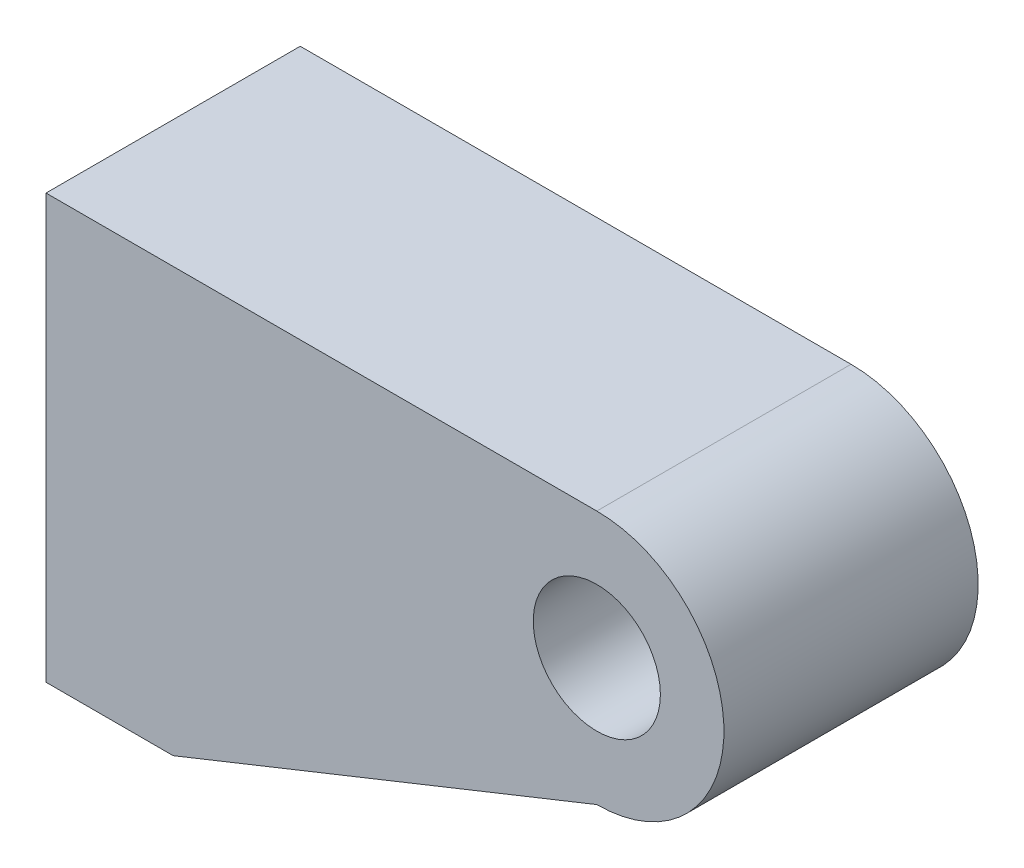
ISO-10303-21;
HEADER;
FILE_DESCRIPTION(('STEP AP214'),'2;1');
FILE_NAME('part.step','',(''),(''),'','','');
FILE_SCHEMA(('AUTOMOTIVE_DESIGN { 1 0 10303 214 1 1 1 1 }'));
ENDSEC;
DATA;
#1=APPLICATION_CONTEXT('core data for automotive mechanical design processes');
#2=APPLICATION_PROTOCOL_DEFINITION('international standard','automotive_design',2000,#1);
#3=PRODUCT_CONTEXT('',#1,'mechanical');
#4=PRODUCT('Part','Part','',(#3));
#5=PRODUCT_RELATED_PRODUCT_CATEGORY('part','',(#4));
#6=PRODUCT_DEFINITION_FORMATION('','',#4);
#7=PRODUCT_DEFINITION_CONTEXT('part definition',#1,'design');
#8=PRODUCT_DEFINITION('design','',#6,#7);
#9=PRODUCT_DEFINITION_SHAPE('','',#8);
#10=(LENGTH_UNIT() NAMED_UNIT(*) SI_UNIT(.MILLI.,.METRE.));
#11=(NAMED_UNIT(*) PLANE_ANGLE_UNIT() SI_UNIT($,.RADIAN.));
#12=(NAMED_UNIT(*) SI_UNIT($,.STERADIAN.) SOLID_ANGLE_UNIT());
#13=UNCERTAINTY_MEASURE_WITH_UNIT(LENGTH_MEASURE(1.E-05),#10,'distance_accuracy_value','');
#14=(GEOMETRIC_REPRESENTATION_CONTEXT(3) GLOBAL_UNCERTAINTY_ASSIGNED_CONTEXT((#13)) GLOBAL_UNIT_ASSIGNED_CONTEXT((#10,
#11,#12)) REPRESENTATION_CONTEXT('',''));
#15=CARTESIAN_POINT('',(0.,0.,0.));
#16=DIRECTION('',(0.,0.,1.));
#17=DIRECTION('',(1.,0.,0.));
#18=AXIS2_PLACEMENT_3D('',#15,#16,#17);
#19=CARTESIAN_POINT('',(13.,-3.,6.));
#20=DIRECTION('',(0.,0.,-1.));
#21=DIRECTION('',(-1.,0.,0.));
#22=AXIS2_PLACEMENT_3D('',#19,#20,#21);
#23=PLANE('',#22);
#24=DIRECTION('',(0.,-1.,0.));
#25=VECTOR('',#24,1.);
#26=CARTESIAN_POINT('',(0.,0.,6.));
#27=LINE('',#26,#25);
#28=CARTESIAN_POINT('',(0.,0.,6.));
#29=VERTEX_POINT('',#28);
#30=CARTESIAN_POINT('',(0.,-10.,6.));
#31=VERTEX_POINT('',#30);
#32=EDGE_CURVE('E116',#29,#31,#27,.T.);
#33=ORIENTED_EDGE('',*,*,#32,.T.);
#34=DIRECTION('',(1.,0.,0.));
#35=VECTOR('',#34,1.);
#36=CARTESIAN_POINT('',(0.,-10.,6.));
#37=LINE('',#36,#35);
#38=CARTESIAN_POINT('',(3.,-10.,6.));
#39=VERTEX_POINT('',#38);
#40=EDGE_CURVE('E83',#31,#39,#37,.T.);
#41=ORIENTED_EDGE('',*,*,#40,.T.);
#42=DIRECTION('',(0.928476690885259,0.371390676354104,0.));
#43=VECTOR('',#42,1.);
#44=CARTESIAN_POINT('',(3.,-10.,6.));
#45=LINE('',#44,#43);
#46=CARTESIAN_POINT('',(13.,-6.,6.));
#47=VERTEX_POINT('',#46);
#48=EDGE_CURVE('E87',#39,#47,#45,.T.);
#49=ORIENTED_EDGE('',*,*,#48,.T.);
#50=CARTESIAN_POINT('',(13.,-3.,6.));
#51=DIRECTION('',(0.,0.,1.));
#52=DIRECTION('',(-1.,0.,0.));
#53=AXIS2_PLACEMENT_3D('',#50,#51,#52);
#54=CIRCLE('',#53,3.);
#55=CARTESIAN_POINT('',(13.,0.,6.));
#56=VERTEX_POINT('',#55);
#57=EDGE_CURVE('E91',#47,#56,#54,.T.);
#58=ORIENTED_EDGE('',*,*,#57,.T.);
#59=DIRECTION('',(-1.,0.,0.));
#60=VECTOR('',#59,1.);
#61=CARTESIAN_POINT('',(0.,0.,6.));
#62=LINE('',#61,#60);
#63=EDGE_CURVE('E49',#56,#29,#62,.T.);
#64=ORIENTED_EDGE('',*,*,#63,.T.);
#65=EDGE_LOOP('',(#33,#41,#49,#58,#64));
#66=FACE_BOUND('',#65,.T.);
#67=CARTESIAN_POINT('',(13.,-3.,6.));
#68=DIRECTION('',(0.,0.,1.));
#69=DIRECTION('',(1.,0.,0.));
#70=AXIS2_PLACEMENT_3D('',#67,#68,#69);
#71=CIRCLE('',#70,1.5);
#72=CARTESIAN_POINT('',(14.5,-3.,6.));
#73=VERTEX_POINT('',#72);
#74=EDGE_CURVE('E111',#73,#73,#71,.T.);
#75=ORIENTED_EDGE('',*,*,#74,.F.);
#76=EDGE_LOOP('',(#75));
#77=FACE_BOUND('',#76,.T.);
#78=ADVANCED_FACE('F32',(#66,#77),#23,.F.);
#79=CARTESIAN_POINT('',(13.,-3.,0.));
#80=DIRECTION('',(0.,0.,-1.));
#81=DIRECTION('',(-1.,0.,0.));
#82=AXIS2_PLACEMENT_3D('',#79,#80,#81);
#83=PLANE('',#82);
#84=DIRECTION('',(0.,-1.,0.));
#85=VECTOR('',#84,1.);
#86=CARTESIAN_POINT('',(0.,0.,0.));
#87=LINE('',#86,#85);
#88=CARTESIAN_POINT('',(0.,0.,0.));
#89=VERTEX_POINT('',#88);
#90=CARTESIAN_POINT('',(0.,-10.,0.));
#91=VERTEX_POINT('',#90);
#92=EDGE_CURVE('E107',#89,#91,#87,.T.);
#93=ORIENTED_EDGE('',*,*,#92,.F.);
#94=DIRECTION('',(-1.,0.,0.));
#95=VECTOR('',#94,1.);
#96=CARTESIAN_POINT('',(0.,0.,0.));
#97=LINE('',#96,#95);
#98=CARTESIAN_POINT('',(13.,0.,0.));
#99=VERTEX_POINT('',#98);
#100=EDGE_CURVE('E75',#99,#89,#97,.T.);
#101=ORIENTED_EDGE('',*,*,#100,.F.);
#102=CARTESIAN_POINT('',(13.,-3.,0.));
#103=DIRECTION('',(0.,0.,1.));
#104=DIRECTION('',(-1.,0.,0.));
#105=AXIS2_PLACEMENT_3D('',#102,#103,#104);
#106=CIRCLE('',#105,3.);
#107=CARTESIAN_POINT('',(13.,-6.,0.));
#108=VERTEX_POINT('',#107);
#109=EDGE_CURVE('E69',#108,#99,#106,.T.);
#110=ORIENTED_EDGE('',*,*,#109,.F.);
#111=DIRECTION('',(0.928476690885259,0.371390676354104,0.));
#112=VECTOR('',#111,1.);
#113=CARTESIAN_POINT('',(3.,-10.,0.));
#114=LINE('',#113,#112);
#115=CARTESIAN_POINT('',(3.,-10.,0.));
#116=VERTEX_POINT('',#115);
#117=EDGE_CURVE('E98',#116,#108,#114,.T.);
#118=ORIENTED_EDGE('',*,*,#117,.F.);
#119=DIRECTION('',(1.,0.,0.));
#120=VECTOR('',#119,1.);
#121=CARTESIAN_POINT('',(0.,-10.,0.));
#122=LINE('',#121,#120);
#123=EDGE_CURVE('E110',#91,#116,#122,.T.);
#124=ORIENTED_EDGE('',*,*,#123,.F.);
#125=EDGE_LOOP('',(#93,#101,#110,#118,#124));
#126=FACE_BOUND('',#125,.T.);
#127=CARTESIAN_POINT('',(13.,-3.,0.));
#128=DIRECTION('',(0.,0.,1.));
#129=DIRECTION('',(1.,0.,0.));
#130=AXIS2_PLACEMENT_3D('',#127,#128,#129);
#131=CIRCLE('',#130,1.5);
#132=CARTESIAN_POINT('',(14.5,-3.,0.));
#133=VERTEX_POINT('',#132);
#134=EDGE_CURVE('E196',#133,#133,#131,.T.);
#135=ORIENTED_EDGE('',*,*,#134,.T.);
#136=EDGE_LOOP('',(#135));
#137=FACE_BOUND('',#136,.T.);
#138=ADVANCED_FACE('F120',(#126,#137),#83,.T.);
#139=CARTESIAN_POINT('',(0.,0.,6.));
#140=DIRECTION('',(1.,0.,0.));
#141=DIRECTION('',(0.,1.,0.));
#142=AXIS2_PLACEMENT_3D('',#139,#140,#141);
#143=PLANE('',#142);
#144=ORIENTED_EDGE('',*,*,#92,.T.);
#145=DIRECTION('',(0.,0.,-1.));
#146=VECTOR('',#145,1.);
#147=CARTESIAN_POINT('',(0.,-10.,6.));
#148=LINE('',#147,#146);
#149=EDGE_CURVE('E11',#31,#91,#148,.T.);
#150=ORIENTED_EDGE('',*,*,#149,.F.);
#151=ORIENTED_EDGE('',*,*,#32,.F.);
#152=DIRECTION('',(0.,0.,-1.));
#153=VECTOR('',#152,1.);
#154=CARTESIAN_POINT('',(0.,0.,6.));
#155=LINE('',#154,#153);
#156=EDGE_CURVE('E103',#29,#89,#155,.T.);
#157=ORIENTED_EDGE('',*,*,#156,.T.);
#158=EDGE_LOOP('',(#144,#150,#151,#157));
#159=FACE_BOUND('',#158,.T.);
#160=ADVANCED_FACE('F34',(#159),#143,.F.);
#161=CARTESIAN_POINT('',(0.,-10.,6.));
#162=DIRECTION('',(0.,1.,0.));
#163=DIRECTION('',(0.,0.,1.));
#164=AXIS2_PLACEMENT_3D('',#161,#162,#163);
#165=PLANE('',#164);
#166=ORIENTED_EDGE('',*,*,#123,.T.);
#167=DIRECTION('',(0.,0.,-1.));
#168=VECTOR('',#167,1.);
#169=CARTESIAN_POINT('',(3.,-10.,6.));
#170=LINE('',#169,#168);
#171=EDGE_CURVE('E41',#39,#116,#170,.T.);
#172=ORIENTED_EDGE('',*,*,#171,.F.);
#173=ORIENTED_EDGE('',*,*,#40,.F.);
#174=ORIENTED_EDGE('',*,*,#149,.T.);
#175=EDGE_LOOP('',(#166,#172,#173,#174));
#176=FACE_BOUND('',#175,.T.);
#177=ADVANCED_FACE('F145',(#176),#165,.F.);
#178=CARTESIAN_POINT('',(3.,-10.,6.));
#179=DIRECTION('',(-0.371390676354104,0.928476690885259,0.));
#180=DIRECTION('',(-0.928476690885259,-0.371390676354104,0.));
#181=AXIS2_PLACEMENT_3D('',#178,#179,#180);
#182=PLANE('',#181);
#183=ORIENTED_EDGE('',*,*,#117,.T.);
#184=DIRECTION('',(0.,0.,-1.));
#185=VECTOR('',#184,1.);
#186=CARTESIAN_POINT('',(13.,-6.,6.));
#187=LINE('',#186,#185);
#188=EDGE_CURVE('E95',#47,#108,#187,.T.);
#189=ORIENTED_EDGE('',*,*,#188,.F.);
#190=ORIENTED_EDGE('',*,*,#48,.F.);
#191=ORIENTED_EDGE('',*,*,#171,.T.);
#192=EDGE_LOOP('',(#183,#189,#190,#191));
#193=FACE_BOUND('',#192,.T.);
#194=ADVANCED_FACE('F96',(#193),#182,.F.);
#195=CARTESIAN_POINT('',(13.,-3.,6.));
#196=DIRECTION('',(0.,0.,-1.));
#197=DIRECTION('',(-1.,0.,0.));
#198=AXIS2_PLACEMENT_3D('',#195,#196,#197);
#199=CYLINDRICAL_SURFACE('',#198,3.);
#200=ORIENTED_EDGE('',*,*,#109,.T.);
#201=DIRECTION('',(0.,0.,-1.));
#202=VECTOR('',#201,1.);
#203=CARTESIAN_POINT('',(13.,0.,6.));
#204=LINE('',#203,#202);
#205=EDGE_CURVE('E99',#56,#99,#204,.T.);
#206=ORIENTED_EDGE('',*,*,#205,.F.);
#207=ORIENTED_EDGE('',*,*,#57,.F.);
#208=ORIENTED_EDGE('',*,*,#188,.T.);
#209=EDGE_LOOP('',(#200,#206,#207,#208));
#210=FACE_BOUND('',#209,.T.);
#211=ADVANCED_FACE('F101',(#210),#199,.T.);
#212=CARTESIAN_POINT('',(0.,0.,6.));
#213=DIRECTION('',(0.,-1.,0.));
#214=DIRECTION('',(0.,0.,-1.));
#215=AXIS2_PLACEMENT_3D('',#212,#213,#214);
#216=PLANE('',#215);
#217=ORIENTED_EDGE('',*,*,#100,.T.);
#218=ORIENTED_EDGE('',*,*,#156,.F.);
#219=ORIENTED_EDGE('',*,*,#63,.F.);
#220=ORIENTED_EDGE('',*,*,#205,.T.);
#221=EDGE_LOOP('',(#217,#218,#219,#220));
#222=FACE_BOUND('',#221,.T.);
#223=ADVANCED_FACE('F125',(#222),#216,.F.);
#224=CARTESIAN_POINT('',(13.,-3.,6.));
#225=DIRECTION('',(0.,0.,-1.));
#226=DIRECTION('',(-1.,0.,0.));
#227=AXIS2_PLACEMENT_3D('',#224,#225,#226);
#228=CYLINDRICAL_SURFACE('',#227,1.5);
#229=ORIENTED_EDGE('',*,*,#74,.T.);
#230=EDGE_LOOP('',(#229));
#231=FACE_BOUND('',#230,.T.);
#232=ORIENTED_EDGE('',*,*,#134,.F.);
#233=EDGE_LOOP('',(#232));
#234=FACE_BOUND('',#233,.T.);
#235=ADVANCED_FACE('F127',(#231,#234),#228,.F.);
#236=CLOSED_SHELL('',(#78,#138,#160,#177,#194,#211,#223,#235));
#237=MANIFOLD_SOLID_BREP('B2',#236);
#238=ADVANCED_BREP_SHAPE_REPRESENTATION('',(#18,#237),#14);
#239=SHAPE_DEFINITION_REPRESENTATION(#9,#238);
ENDSEC;
END-ISO-10303-21;
